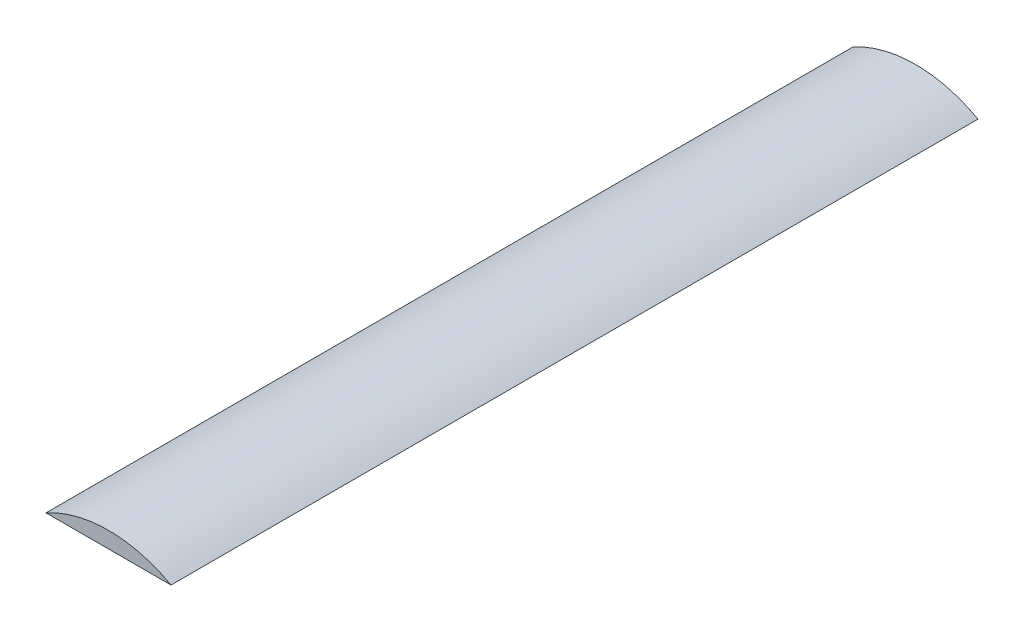
ISO-10303-21;
HEADER;
FILE_DESCRIPTION(('STEP AP214'),'2;1');
FILE_NAME('part.step','',(''),(''),'','','');
FILE_SCHEMA(('AUTOMOTIVE_DESIGN { 1 0 10303 214 1 1 1 1 }'));
ENDSEC;
DATA;
#1=APPLICATION_CONTEXT('core data for automotive mechanical design processes');
#2=APPLICATION_PROTOCOL_DEFINITION('international standard','automotive_design',2000,#1);
#3=PRODUCT_CONTEXT('',#1,'mechanical');
#4=PRODUCT('Part','Part','',(#3));
#5=PRODUCT_RELATED_PRODUCT_CATEGORY('part','',(#4));
#6=PRODUCT_DEFINITION_FORMATION('','',#4);
#7=PRODUCT_DEFINITION_CONTEXT('part definition',#1,'design');
#8=PRODUCT_DEFINITION('design','',#6,#7);
#9=PRODUCT_DEFINITION_SHAPE('','',#8);
#10=(LENGTH_UNIT() NAMED_UNIT(*) SI_UNIT(.MILLI.,.METRE.));
#11=(NAMED_UNIT(*) PLANE_ANGLE_UNIT() SI_UNIT($,.RADIAN.));
#12=(NAMED_UNIT(*) SI_UNIT($,.STERADIAN.) SOLID_ANGLE_UNIT());
#13=UNCERTAINTY_MEASURE_WITH_UNIT(LENGTH_MEASURE(1.E-05),#10,'distance_accuracy_value','');
#14=(GEOMETRIC_REPRESENTATION_CONTEXT(3) GLOBAL_UNCERTAINTY_ASSIGNED_CONTEXT((#13)) GLOBAL_UNIT_ASSIGNED_CONTEXT((#10,
#11,#12)) REPRESENTATION_CONTEXT('',''));
#15=CARTESIAN_POINT('',(0.,0.,0.));
#16=DIRECTION('',(0.,0.,1.));
#17=DIRECTION('',(1.,0.,0.));
#18=AXIS2_PLACEMENT_3D('',#15,#16,#17);
#19=CARTESIAN_POINT('',(5.,-13.,100.));
#20=DIRECTION('',(0.,0.,-1.));
#21=DIRECTION('',(-1.,0.,0.));
#22=AXIS2_PLACEMENT_3D('',#19,#20,#21);
#23=CYLINDRICAL_SURFACE('',#22,16.);
#24=CARTESIAN_POINT('',(5.,-13.,0.));
#25=DIRECTION('',(0.,0.,1.));
#26=DIRECTION('',(-1.,0.,0.));
#27=AXIS2_PLACEMENT_3D('',#24,#25,#26);
#28=CIRCLE('',#27,16.);
#29=CARTESIAN_POINT('',(12.7459666924148,1.,0.));
#30=VERTEX_POINT('',#29);
#31=CARTESIAN_POINT('',(-2.74596669241483,0.999999999999999,0.));
#32=VERTEX_POINT('',#31);
#33=EDGE_CURVE('E68',#30,#32,#28,.T.);
#34=ORIENTED_EDGE('',*,*,#33,.T.);
#35=DIRECTION('',(0.,0.,-1.));
#36=VECTOR('',#35,1.);
#37=CARTESIAN_POINT('',(-2.74596669241483,0.999999999999999,100.));
#38=LINE('',#37,#36);
#39=CARTESIAN_POINT('',(-2.74596669241483,0.999999999999999,100.));
#40=VERTEX_POINT('',#39);
#41=EDGE_CURVE('E11',#40,#32,#38,.T.);
#42=ORIENTED_EDGE('',*,*,#41,.F.);
#43=CARTESIAN_POINT('',(5.,-13.,100.));
#44=DIRECTION('',(0.,0.,1.));
#45=DIRECTION('',(-1.,0.,0.));
#46=AXIS2_PLACEMENT_3D('',#43,#44,#45);
#47=CIRCLE('',#46,16.);
#48=CARTESIAN_POINT('',(12.7459666924148,1.,100.));
#49=VERTEX_POINT('',#48);
#50=EDGE_CURVE('E67',#49,#40,#47,.T.);
#51=ORIENTED_EDGE('',*,*,#50,.F.);
#52=DIRECTION('',(0.,0.,-1.));
#53=VECTOR('',#52,1.);
#54=CARTESIAN_POINT('',(12.7459666924148,1.,100.));
#55=LINE('',#54,#53);
#56=EDGE_CURVE('E45',#49,#30,#55,.T.);
#57=ORIENTED_EDGE('',*,*,#56,.T.);
#58=EDGE_LOOP('',(#34,#42,#51,#57));
#59=FACE_BOUND('',#58,.T.);
#60=ADVANCED_FACE('F37',(#59),#23,.T.);
#61=CARTESIAN_POINT('',(5.,1.,100.));
#62=DIRECTION('',(0.,1.,0.));
#63=DIRECTION('',(-1.,0.,0.));
#64=AXIS2_PLACEMENT_3D('',#61,#62,#63);
#65=PLANE('',#64);
#66=DIRECTION('',(1.,0.,0.));
#67=VECTOR('',#66,1.);
#68=CARTESIAN_POINT('',(5.,1.,0.));
#69=LINE('',#68,#67);
#70=EDGE_CURVE('E60',#32,#30,#69,.T.);
#71=ORIENTED_EDGE('',*,*,#70,.T.);
#72=ORIENTED_EDGE('',*,*,#56,.F.);
#73=DIRECTION('',(1.,0.,0.));
#74=VECTOR('',#73,1.);
#75=CARTESIAN_POINT('',(5.,1.,100.));
#76=LINE('',#75,#74);
#77=EDGE_CURVE('E52',#40,#49,#76,.T.);
#78=ORIENTED_EDGE('',*,*,#77,.F.);
#79=ORIENTED_EDGE('',*,*,#41,.T.);
#80=EDGE_LOOP('',(#71,#72,#78,#79));
#81=FACE_BOUND('',#80,.T.);
#82=ADVANCED_FACE('F63',(#81),#65,.F.);
#83=CARTESIAN_POINT('',(5.,-13.,100.));
#84=DIRECTION('',(0.,0.,-1.));
#85=DIRECTION('',(-1.,0.,0.));
#86=AXIS2_PLACEMENT_3D('',#83,#84,#85);
#87=PLANE('',#86);
#88=ORIENTED_EDGE('',*,*,#50,.T.);
#89=ORIENTED_EDGE('',*,*,#77,.T.);
#90=EDGE_LOOP('',(#88,#89));
#91=FACE_BOUND('',#90,.T.);
#92=ADVANCED_FACE('F75',(#91),#87,.F.);
#93=CARTESIAN_POINT('',(5.,-13.,0.));
#94=DIRECTION('',(0.,0.,-1.));
#95=DIRECTION('',(-1.,0.,0.));
#96=AXIS2_PLACEMENT_3D('',#93,#94,#95);
#97=PLANE('',#96);
#98=ORIENTED_EDGE('',*,*,#33,.F.);
#99=ORIENTED_EDGE('',*,*,#70,.F.);
#100=EDGE_LOOP('',(#98,#99));
#101=FACE_BOUND('',#100,.T.);
#102=ADVANCED_FACE('F71',(#101),#97,.T.);
#103=CLOSED_SHELL('',(#60,#82,#92,#102));
#104=MANIFOLD_SOLID_BREP('B2',#103);
#105=ADVANCED_BREP_SHAPE_REPRESENTATION('',(#18,#104),#14);
#106=SHAPE_DEFINITION_REPRESENTATION(#9,#105);
ENDSEC;
END-ISO-10303-21;
